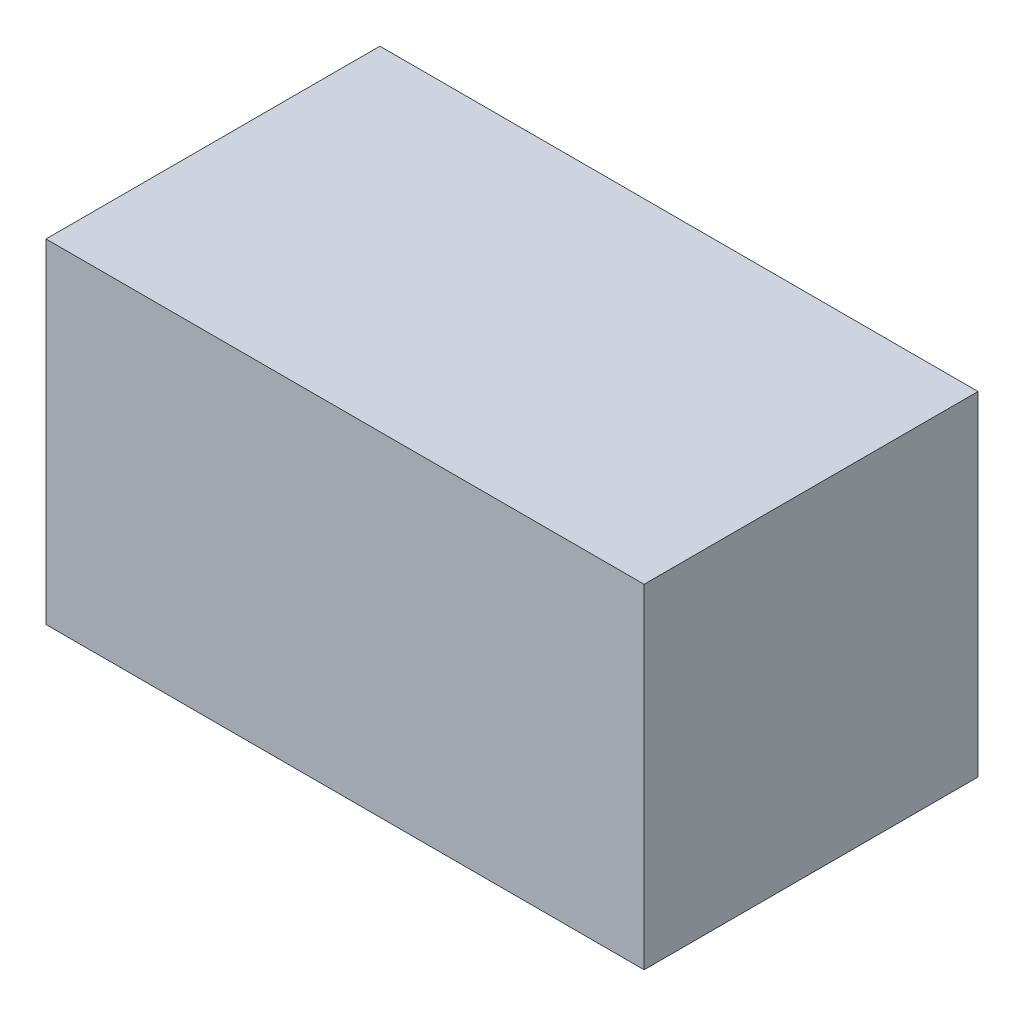
ISO-10303-21;
HEADER;
FILE_DESCRIPTION(('STEP AP214'),'2;1');
FILE_NAME('part.step','',(''),(''),'','','');
FILE_SCHEMA(('AUTOMOTIVE_DESIGN { 1 0 10303 214 1 1 1 1 }'));
ENDSEC;
DATA;
#1=APPLICATION_CONTEXT('core data for automotive mechanical design processes');
#2=APPLICATION_PROTOCOL_DEFINITION('international standard','automotive_design',2000,#1);
#3=PRODUCT_CONTEXT('',#1,'mechanical');
#4=PRODUCT('Part','Part','',(#3));
#5=PRODUCT_RELATED_PRODUCT_CATEGORY('part','',(#4));
#6=PRODUCT_DEFINITION_FORMATION('','',#4);
#7=PRODUCT_DEFINITION_CONTEXT('part definition',#1,'design');
#8=PRODUCT_DEFINITION('design','',#6,#7);
#9=PRODUCT_DEFINITION_SHAPE('','',#8);
#10=(LENGTH_UNIT() NAMED_UNIT(*) SI_UNIT(.MILLI.,.METRE.));
#11=(NAMED_UNIT(*) PLANE_ANGLE_UNIT() SI_UNIT($,.RADIAN.));
#12=(NAMED_UNIT(*) SI_UNIT($,.STERADIAN.) SOLID_ANGLE_UNIT());
#13=UNCERTAINTY_MEASURE_WITH_UNIT(LENGTH_MEASURE(1.E-05),#10,'distance_accuracy_value','');
#14=(GEOMETRIC_REPRESENTATION_CONTEXT(3) GLOBAL_UNCERTAINTY_ASSIGNED_CONTEXT((#13)) GLOBAL_UNIT_ASSIGNED_CONTEXT((#10,
#11,#12)) REPRESENTATION_CONTEXT('',''));
#15=CARTESIAN_POINT('',(0.,0.,0.));
#16=DIRECTION('',(0.,0.,1.));
#17=DIRECTION('',(1.,0.,0.));
#18=AXIS2_PLACEMENT_3D('',#15,#16,#17);
#19=CARTESIAN_POINT('',(-1.2988,0.725,1.45));
#20=DIRECTION('',(0.,-1.,0.));
#21=DIRECTION('',(0.,0.,-1.));
#22=AXIS2_PLACEMENT_3D('',#19,#20,#21);
#23=PLANE('',#22);
#24=DIRECTION('',(-1.,0.,0.));
#25=VECTOR('',#24,1.);
#26=CARTESIAN_POINT('',(-1.2988,0.725,0.));
#27=LINE('',#26,#25);
#28=CARTESIAN_POINT('',(1.2987,0.725,0.));
#29=VERTEX_POINT('',#28);
#30=CARTESIAN_POINT('',(-1.2988,0.725,0.));
#31=VERTEX_POINT('',#30);
#32=EDGE_CURVE('E97',#29,#31,#27,.T.);
#33=ORIENTED_EDGE('',*,*,#32,.T.);
#34=DIRECTION('',(0.,0.,-1.));
#35=VECTOR('',#34,1.);
#36=CARTESIAN_POINT('',(-1.2988,0.725,1.45));
#37=LINE('',#36,#35);
#38=CARTESIAN_POINT('',(-1.2988,0.725,1.45));
#39=VERTEX_POINT('',#38);
#40=EDGE_CURVE('E11',#39,#31,#37,.T.);
#41=ORIENTED_EDGE('',*,*,#40,.F.);
#42=DIRECTION('',(-1.,0.,0.));
#43=VECTOR('',#42,1.);
#44=CARTESIAN_POINT('',(-1.2988,0.725,1.45));
#45=LINE('',#44,#43);
#46=CARTESIAN_POINT('',(1.2987,0.725,1.45));
#47=VERTEX_POINT('',#46);
#48=EDGE_CURVE('E85',#47,#39,#45,.T.);
#49=ORIENTED_EDGE('',*,*,#48,.F.);
#50=DIRECTION('',(0.,0.,-1.));
#51=VECTOR('',#50,1.);
#52=CARTESIAN_POINT('',(1.2987,0.725,1.45));
#53=LINE('',#52,#51);
#54=EDGE_CURVE('E93',#47,#29,#53,.T.);
#55=ORIENTED_EDGE('',*,*,#54,.T.);
#56=EDGE_LOOP('',(#33,#41,#49,#55));
#57=FACE_BOUND('',#56,.T.);
#58=ADVANCED_FACE('F34',(#57),#23,.F.);
#59=CARTESIAN_POINT('',(-1.2988,-0.725,1.45));
#60=DIRECTION('',(1.,0.,0.));
#61=DIRECTION('',(0.,0.,-1.));
#62=AXIS2_PLACEMENT_3D('',#59,#60,#61);
#63=PLANE('',#62);
#64=DIRECTION('',(0.,-1.,0.));
#65=VECTOR('',#64,1.);
#66=CARTESIAN_POINT('',(-1.2988,-0.725,0.));
#67=LINE('',#66,#65);
#68=CARTESIAN_POINT('',(-1.2988,-0.725,0.));
#69=VERTEX_POINT('',#68);
#70=EDGE_CURVE('E89',#31,#69,#67,.T.);
#71=ORIENTED_EDGE('',*,*,#70,.T.);
#72=DIRECTION('',(0.,0.,-1.));
#73=VECTOR('',#72,1.);
#74=CARTESIAN_POINT('',(-1.2988,-0.725,1.45));
#75=LINE('',#74,#73);
#76=CARTESIAN_POINT('',(-1.2988,-0.725,1.45));
#77=VERTEX_POINT('',#76);
#78=EDGE_CURVE('E42',#77,#69,#75,.T.);
#79=ORIENTED_EDGE('',*,*,#78,.F.);
#80=DIRECTION('',(0.,-1.,0.));
#81=VECTOR('',#80,1.);
#82=CARTESIAN_POINT('',(-1.2988,-0.725,1.45));
#83=LINE('',#82,#81);
#84=EDGE_CURVE('E80',#39,#77,#83,.T.);
#85=ORIENTED_EDGE('',*,*,#84,.F.);
#86=ORIENTED_EDGE('',*,*,#40,.T.);
#87=EDGE_LOOP('',(#71,#79,#85,#86));
#88=FACE_BOUND('',#87,.T.);
#89=ADVANCED_FACE('F88',(#88),#63,.F.);
#90=CARTESIAN_POINT('',(1.2987,-0.725,1.45));
#91=DIRECTION('',(0.,1.,0.));
#92=DIRECTION('',(0.,0.,1.));
#93=AXIS2_PLACEMENT_3D('',#90,#91,#92);
#94=PLANE('',#93);
#95=DIRECTION('',(1.,0.,0.));
#96=VECTOR('',#95,1.);
#97=CARTESIAN_POINT('',(1.2987,-0.725,0.));
#98=LINE('',#97,#96);
#99=CARTESIAN_POINT('',(1.2987,-0.725,0.));
#100=VERTEX_POINT('',#99);
#101=EDGE_CURVE('E67',#69,#100,#98,.T.);
#102=ORIENTED_EDGE('',*,*,#101,.T.);
#103=DIRECTION('',(0.,0.,-1.));
#104=VECTOR('',#103,1.);
#105=CARTESIAN_POINT('',(1.2987,-0.725,1.45));
#106=LINE('',#105,#104);
#107=CARTESIAN_POINT('',(1.2987,-0.725,1.45));
#108=VERTEX_POINT('',#107);
#109=EDGE_CURVE('E90',#108,#100,#106,.T.);
#110=ORIENTED_EDGE('',*,*,#109,.F.);
#111=DIRECTION('',(1.,0.,0.));
#112=VECTOR('',#111,1.);
#113=CARTESIAN_POINT('',(1.2987,-0.725,1.45));
#114=LINE('',#113,#112);
#115=EDGE_CURVE('E83',#77,#108,#114,.T.);
#116=ORIENTED_EDGE('',*,*,#115,.F.);
#117=ORIENTED_EDGE('',*,*,#78,.T.);
#118=EDGE_LOOP('',(#102,#110,#116,#117));
#119=FACE_BOUND('',#118,.T.);
#120=ADVANCED_FACE('F91',(#119),#94,.F.);
#121=CARTESIAN_POINT('',(1.2987,0.725,1.45));
#122=DIRECTION('',(-1.,0.,0.));
#123=DIRECTION('',(0.,0.,1.));
#124=AXIS2_PLACEMENT_3D('',#121,#122,#123);
#125=PLANE('',#124);
#126=DIRECTION('',(0.,1.,0.));
#127=VECTOR('',#126,1.);
#128=CARTESIAN_POINT('',(1.2987,0.725,0.));
#129=LINE('',#128,#127);
#130=EDGE_CURVE('E73',#100,#29,#129,.T.);
#131=ORIENTED_EDGE('',*,*,#130,.T.);
#132=ORIENTED_EDGE('',*,*,#54,.F.);
#133=DIRECTION('',(0.,1.,0.));
#134=VECTOR('',#133,1.);
#135=CARTESIAN_POINT('',(1.2987,0.725,1.45));
#136=LINE('',#135,#134);
#137=EDGE_CURVE('E50',#108,#47,#136,.T.);
#138=ORIENTED_EDGE('',*,*,#137,.F.);
#139=ORIENTED_EDGE('',*,*,#109,.T.);
#140=EDGE_LOOP('',(#131,#132,#138,#139));
#141=FACE_BOUND('',#140,.T.);
#142=ADVANCED_FACE('F104',(#141),#125,.F.);
#143=CARTESIAN_POINT('',(0.,0.,1.45));
#144=DIRECTION('',(0.,0.,-1.));
#145=DIRECTION('',(-1.,0.,0.));
#146=AXIS2_PLACEMENT_3D('',#143,#144,#145);
#147=PLANE('',#146);
#148=ORIENTED_EDGE('',*,*,#48,.T.);
#149=ORIENTED_EDGE('',*,*,#84,.T.);
#150=ORIENTED_EDGE('',*,*,#115,.T.);
#151=ORIENTED_EDGE('',*,*,#137,.T.);
#152=EDGE_LOOP('',(#148,#149,#150,#151));
#153=FACE_BOUND('',#152,.T.);
#154=ADVANCED_FACE('F81',(#153),#147,.F.);
#155=CARTESIAN_POINT('',(0.,0.,0.));
#156=DIRECTION('',(0.,0.,-1.));
#157=DIRECTION('',(-1.,0.,0.));
#158=AXIS2_PLACEMENT_3D('',#155,#156,#157);
#159=PLANE('',#158);
#160=ORIENTED_EDGE('',*,*,#32,.F.);
#161=ORIENTED_EDGE('',*,*,#130,.F.);
#162=ORIENTED_EDGE('',*,*,#101,.F.);
#163=ORIENTED_EDGE('',*,*,#70,.F.);
#164=EDGE_LOOP('',(#160,#161,#162,#163));
#165=FACE_BOUND('',#164,.T.);
#166=ADVANCED_FACE('F107',(#165),#159,.T.);
#167=CLOSED_SHELL('',(#58,#89,#120,#142,#154,#166));
#168=MANIFOLD_SOLID_BREP('B2',#167);
#169=ADVANCED_BREP_SHAPE_REPRESENTATION('',(#18,#168),#14);
#170=SHAPE_DEFINITION_REPRESENTATION(#9,#169);
ENDSEC;
END-ISO-10303-21;
